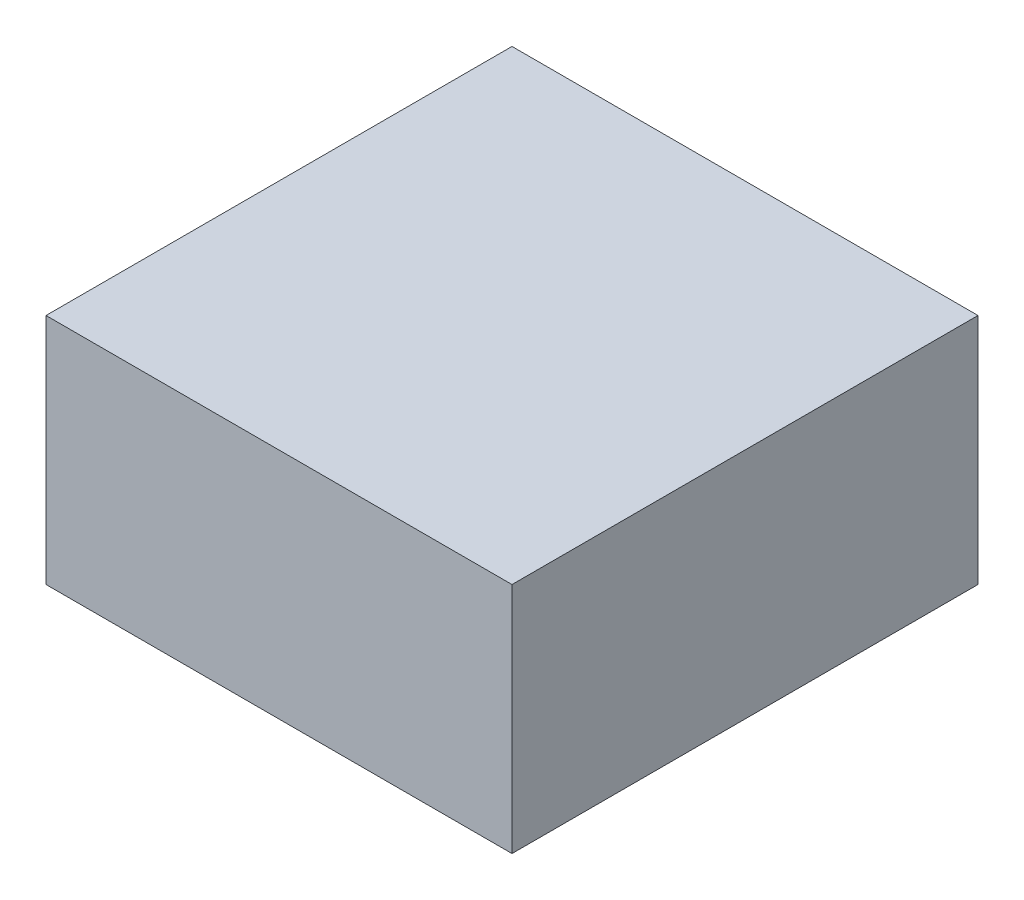
ISO-10303-21;
HEADER;
FILE_DESCRIPTION(('STEP AP214'),'2;1');
FILE_NAME('part.step','',(''),(''),'','','');
FILE_SCHEMA(('AUTOMOTIVE_DESIGN { 1 0 10303 214 1 1 1 1 }'));
ENDSEC;
DATA;
#1=APPLICATION_CONTEXT('core data for automotive mechanical design processes');
#2=APPLICATION_PROTOCOL_DEFINITION('international standard','automotive_design',2000,#1);
#3=PRODUCT_CONTEXT('',#1,'mechanical');
#4=PRODUCT('Part','Part','',(#3));
#5=PRODUCT_RELATED_PRODUCT_CATEGORY('part','',(#4));
#6=PRODUCT_DEFINITION_FORMATION('','',#4);
#7=PRODUCT_DEFINITION_CONTEXT('part definition',#1,'design');
#8=PRODUCT_DEFINITION('design','',#6,#7);
#9=PRODUCT_DEFINITION_SHAPE('','',#8);
#10=(LENGTH_UNIT() NAMED_UNIT(*) SI_UNIT(.MILLI.,.METRE.));
#11=(NAMED_UNIT(*) PLANE_ANGLE_UNIT() SI_UNIT($,.RADIAN.));
#12=(NAMED_UNIT(*) SI_UNIT($,.STERADIAN.) SOLID_ANGLE_UNIT());
#13=UNCERTAINTY_MEASURE_WITH_UNIT(LENGTH_MEASURE(1.E-05),#10,'distance_accuracy_value','');
#14=(GEOMETRIC_REPRESENTATION_CONTEXT(3) GLOBAL_UNCERTAINTY_ASSIGNED_CONTEXT((#13)) GLOBAL_UNIT_ASSIGNED_CONTEXT((#10,
#11,#12)) REPRESENTATION_CONTEXT('',''));
#15=CARTESIAN_POINT('',(0.,0.,0.));
#16=DIRECTION('',(0.,0.,1.));
#17=DIRECTION('',(1.,0.,0.));
#18=AXIS2_PLACEMENT_3D('',#15,#16,#17);
#19=CARTESIAN_POINT('',(0.,0.,3.048));
#20=DIRECTION('',(1.,0.,0.));
#21=DIRECTION('',(0.,0.,-1.));
#22=AXIS2_PLACEMENT_3D('',#19,#20,#21);
#23=PLANE('',#22);
#24=DIRECTION('',(0.,-1.,0.));
#25=VECTOR('',#24,1.);
#26=CARTESIAN_POINT('',(0.,0.,0.));
#27=LINE('',#26,#25);
#28=CARTESIAN_POINT('',(0.,1.524,0.));
#29=VERTEX_POINT('',#28);
#30=CARTESIAN_POINT('',(0.,0.,0.));
#31=VERTEX_POINT('',#30);
#32=EDGE_CURVE('E97',#29,#31,#27,.T.);
#33=ORIENTED_EDGE('',*,*,#32,.T.);
#34=DIRECTION('',(0.,0.,-1.));
#35=VECTOR('',#34,1.);
#36=CARTESIAN_POINT('',(0.,0.,3.048));
#37=LINE('',#36,#35);
#38=CARTESIAN_POINT('',(0.,0.,3.048));
#39=VERTEX_POINT('',#38);
#40=EDGE_CURVE('E11',#39,#31,#37,.T.);
#41=ORIENTED_EDGE('',*,*,#40,.F.);
#42=DIRECTION('',(0.,-1.,0.));
#43=VECTOR('',#42,1.);
#44=CARTESIAN_POINT('',(0.,0.,3.048));
#45=LINE('',#44,#43);
#46=CARTESIAN_POINT('',(0.,1.524,3.048));
#47=VERTEX_POINT('',#46);
#48=EDGE_CURVE('E85',#47,#39,#45,.T.);
#49=ORIENTED_EDGE('',*,*,#48,.F.);
#50=DIRECTION('',(0.,0.,-1.));
#51=VECTOR('',#50,1.);
#52=CARTESIAN_POINT('',(0.,1.524,3.048));
#53=LINE('',#52,#51);
#54=EDGE_CURVE('E93',#47,#29,#53,.T.);
#55=ORIENTED_EDGE('',*,*,#54,.T.);
#56=EDGE_LOOP('',(#33,#41,#49,#55));
#57=FACE_BOUND('',#56,.T.);
#58=ADVANCED_FACE('F34',(#57),#23,.F.);
#59=CARTESIAN_POINT('',(0.,0.,3.048));
#60=DIRECTION('',(0.,1.,0.));
#61=DIRECTION('',(0.,0.,1.));
#62=AXIS2_PLACEMENT_3D('',#59,#60,#61);
#63=PLANE('',#62);
#64=DIRECTION('',(1.,0.,0.));
#65=VECTOR('',#64,1.);
#66=CARTESIAN_POINT('',(0.,0.,0.));
#67=LINE('',#66,#65);
#68=CARTESIAN_POINT('',(3.048,0.,0.));
#69=VERTEX_POINT('',#68);
#70=EDGE_CURVE('E89',#31,#69,#67,.T.);
#71=ORIENTED_EDGE('',*,*,#70,.T.);
#72=DIRECTION('',(0.,0.,-1.));
#73=VECTOR('',#72,1.);
#74=CARTESIAN_POINT('',(3.048,0.,3.048));
#75=LINE('',#74,#73);
#76=CARTESIAN_POINT('',(3.048,0.,3.048));
#77=VERTEX_POINT('',#76);
#78=EDGE_CURVE('E42',#77,#69,#75,.T.);
#79=ORIENTED_EDGE('',*,*,#78,.F.);
#80=DIRECTION('',(1.,0.,0.));
#81=VECTOR('',#80,1.);
#82=CARTESIAN_POINT('',(0.,0.,3.048));
#83=LINE('',#82,#81);
#84=EDGE_CURVE('E80',#39,#77,#83,.T.);
#85=ORIENTED_EDGE('',*,*,#84,.F.);
#86=ORIENTED_EDGE('',*,*,#40,.T.);
#87=EDGE_LOOP('',(#71,#79,#85,#86));
#88=FACE_BOUND('',#87,.T.);
#89=ADVANCED_FACE('F88',(#88),#63,.F.);
#90=CARTESIAN_POINT('',(3.048,0.,3.048));
#91=DIRECTION('',(-1.,0.,0.));
#92=DIRECTION('',(0.,-1.,0.));
#93=AXIS2_PLACEMENT_3D('',#90,#91,#92);
#94=PLANE('',#93);
#95=DIRECTION('',(0.,1.,0.));
#96=VECTOR('',#95,1.);
#97=CARTESIAN_POINT('',(3.048,0.,0.));
#98=LINE('',#97,#96);
#99=CARTESIAN_POINT('',(3.048,1.524,0.));
#100=VERTEX_POINT('',#99);
#101=EDGE_CURVE('E67',#69,#100,#98,.T.);
#102=ORIENTED_EDGE('',*,*,#101,.T.);
#103=DIRECTION('',(0.,0.,-1.));
#104=VECTOR('',#103,1.);
#105=CARTESIAN_POINT('',(3.048,1.524,3.048));
#106=LINE('',#105,#104);
#107=CARTESIAN_POINT('',(3.048,1.524,3.048));
#108=VERTEX_POINT('',#107);
#109=EDGE_CURVE('E90',#108,#100,#106,.T.);
#110=ORIENTED_EDGE('',*,*,#109,.F.);
#111=DIRECTION('',(0.,1.,0.));
#112=VECTOR('',#111,1.);
#113=CARTESIAN_POINT('',(3.048,0.,3.048));
#114=LINE('',#113,#112);
#115=EDGE_CURVE('E83',#77,#108,#114,.T.);
#116=ORIENTED_EDGE('',*,*,#115,.F.);
#117=ORIENTED_EDGE('',*,*,#78,.T.);
#118=EDGE_LOOP('',(#102,#110,#116,#117));
#119=FACE_BOUND('',#118,.T.);
#120=ADVANCED_FACE('F91',(#119),#94,.F.);
#121=CARTESIAN_POINT('',(0.,1.524,3.048));
#122=DIRECTION('',(0.,-1.,0.));
#123=DIRECTION('',(0.,0.,-1.));
#124=AXIS2_PLACEMENT_3D('',#121,#122,#123);
#125=PLANE('',#124);
#126=DIRECTION('',(-1.,0.,0.));
#127=VECTOR('',#126,1.);
#128=CARTESIAN_POINT('',(0.,1.524,0.));
#129=LINE('',#128,#127);
#130=EDGE_CURVE('E73',#100,#29,#129,.T.);
#131=ORIENTED_EDGE('',*,*,#130,.T.);
#132=ORIENTED_EDGE('',*,*,#54,.F.);
#133=DIRECTION('',(-1.,0.,0.));
#134=VECTOR('',#133,1.);
#135=CARTESIAN_POINT('',(0.,1.524,3.048));
#136=LINE('',#135,#134);
#137=EDGE_CURVE('E50',#108,#47,#136,.T.);
#138=ORIENTED_EDGE('',*,*,#137,.F.);
#139=ORIENTED_EDGE('',*,*,#109,.T.);
#140=EDGE_LOOP('',(#131,#132,#138,#139));
#141=FACE_BOUND('',#140,.T.);
#142=ADVANCED_FACE('F104',(#141),#125,.F.);
#143=CARTESIAN_POINT('',(0.,0.,3.048));
#144=DIRECTION('',(0.,0.,-1.));
#145=DIRECTION('',(-1.,0.,0.));
#146=AXIS2_PLACEMENT_3D('',#143,#144,#145);
#147=PLANE('',#146);
#148=ORIENTED_EDGE('',*,*,#48,.T.);
#149=ORIENTED_EDGE('',*,*,#84,.T.);
#150=ORIENTED_EDGE('',*,*,#115,.T.);
#151=ORIENTED_EDGE('',*,*,#137,.T.);
#152=EDGE_LOOP('',(#148,#149,#150,#151));
#153=FACE_BOUND('',#152,.T.);
#154=ADVANCED_FACE('F81',(#153),#147,.F.);
#155=CARTESIAN_POINT('',(0.,0.,0.));
#156=DIRECTION('',(0.,0.,-1.));
#157=DIRECTION('',(-1.,0.,0.));
#158=AXIS2_PLACEMENT_3D('',#155,#156,#157);
#159=PLANE('',#158);
#160=ORIENTED_EDGE('',*,*,#32,.F.);
#161=ORIENTED_EDGE('',*,*,#130,.F.);
#162=ORIENTED_EDGE('',*,*,#101,.F.);
#163=ORIENTED_EDGE('',*,*,#70,.F.);
#164=EDGE_LOOP('',(#160,#161,#162,#163));
#165=FACE_BOUND('',#164,.T.);
#166=ADVANCED_FACE('F107',(#165),#159,.T.);
#167=CLOSED_SHELL('',(#58,#89,#120,#142,#154,#166));
#168=MANIFOLD_SOLID_BREP('B2',#167);
#169=ADVANCED_BREP_SHAPE_REPRESENTATION('',(#18,#168),#14);
#170=SHAPE_DEFINITION_REPRESENTATION(#9,#169);
ENDSEC;
END-ISO-10303-21;
